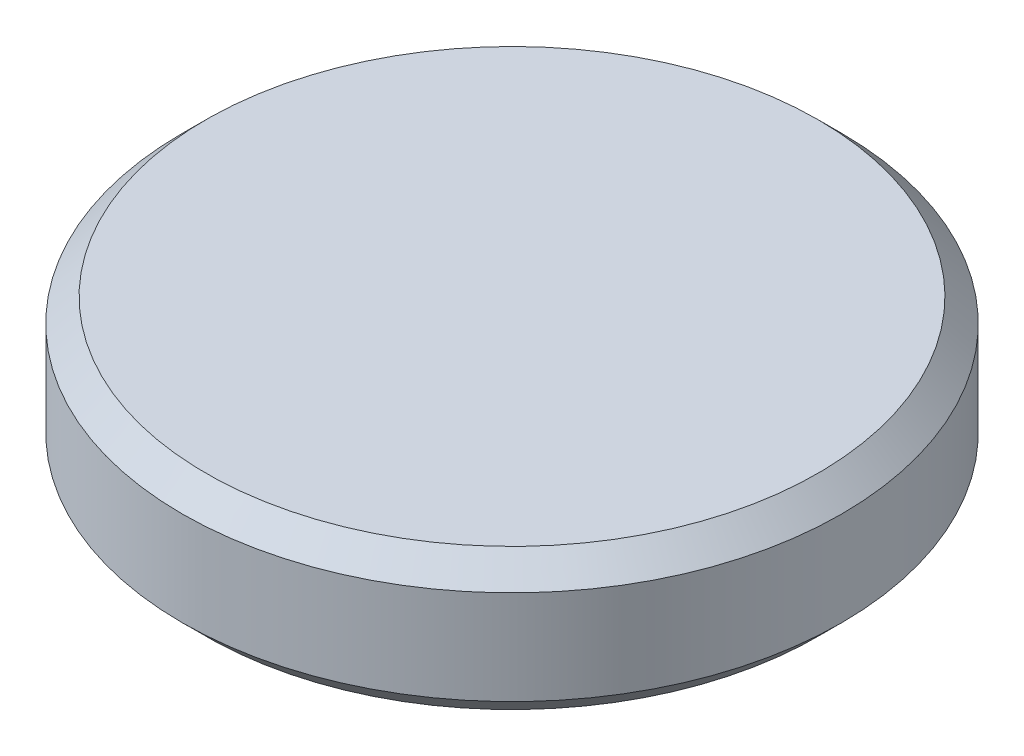
ISO-10303-21;
HEADER;
FILE_DESCRIPTION(('STEP AP214'),'2;1');
FILE_NAME('part.step','',(''),(''),'','','');
FILE_SCHEMA(('AUTOMOTIVE_DESIGN { 1 0 10303 214 1 1 1 1 }'));
ENDSEC;
DATA;
#1=APPLICATION_CONTEXT('core data for automotive mechanical design processes');
#2=APPLICATION_PROTOCOL_DEFINITION('international standard','automotive_design',2000,#1);
#3=PRODUCT_CONTEXT('',#1,'mechanical');
#4=PRODUCT('Part','Part','',(#3));
#5=PRODUCT_RELATED_PRODUCT_CATEGORY('part','',(#4));
#6=PRODUCT_DEFINITION_FORMATION('','',#4);
#7=PRODUCT_DEFINITION_CONTEXT('part definition',#1,'design');
#8=PRODUCT_DEFINITION('design','',#6,#7);
#9=PRODUCT_DEFINITION_SHAPE('','',#8);
#10=(LENGTH_UNIT() NAMED_UNIT(*) SI_UNIT(.MILLI.,.METRE.));
#11=(NAMED_UNIT(*) PLANE_ANGLE_UNIT() SI_UNIT($,.RADIAN.));
#12=(NAMED_UNIT(*) SI_UNIT($,.STERADIAN.) SOLID_ANGLE_UNIT());
#13=UNCERTAINTY_MEASURE_WITH_UNIT(LENGTH_MEASURE(1.E-05),#10,'distance_accuracy_value','');
#14=(GEOMETRIC_REPRESENTATION_CONTEXT(3) GLOBAL_UNCERTAINTY_ASSIGNED_CONTEXT((#13)) GLOBAL_UNIT_ASSIGNED_CONTEXT((#10,
#11,#12)) REPRESENTATION_CONTEXT('',''));
#15=CARTESIAN_POINT('',(0.,0.,0.));
#16=DIRECTION('',(0.,0.,1.));
#17=DIRECTION('',(1.,0.,0.));
#18=AXIS2_PLACEMENT_3D('',#15,#16,#17);
#19=CARTESIAN_POINT('',(0.,0.,0.));
#20=DIRECTION('',(0.,1.,0.));
#21=DIRECTION('',(0.,0.,1.));
#22=AXIS2_PLACEMENT_3D('',#19,#20,#21);
#23=PLANE('',#22);
#24=CARTESIAN_POINT('',(0.,0.,0.));
#25=DIRECTION('',(0.,-1.,0.));
#26=DIRECTION('',(0.,0.,-1.));
#27=AXIS2_PLACEMENT_3D('',#24,#25,#26);
#28=CIRCLE('',#27,6.5);
#29=CARTESIAN_POINT('',(0.,0.,-6.5));
#30=VERTEX_POINT('',#29);
#31=EDGE_CURVE('E10',#30,#30,#28,.T.);
#32=ORIENTED_EDGE('',*,*,#31,.F.);
#33=EDGE_LOOP('',(#32));
#34=FACE_BOUND('',#33,.T.);
#35=ADVANCED_FACE('F35',(#34),#23,.T.);
#36=CARTESIAN_POINT('',(0.,-0.5,0.));
#37=DIRECTION('',(0.,-1.,0.));
#38=DIRECTION('',(0.,0.,-1.));
#39=AXIS2_PLACEMENT_3D('',#36,#37,#38);
#40=CONICAL_SURFACE('',#39,7.,0.785398163397447);
#41=ORIENTED_EDGE('',*,*,#31,.T.);
#42=EDGE_LOOP('',(#41));
#43=FACE_BOUND('',#42,.T.);
#44=CARTESIAN_POINT('',(0.,-0.5,0.));
#45=DIRECTION('',(0.,-1.,0.));
#46=DIRECTION('',(0.,0.,-1.));
#47=AXIS2_PLACEMENT_3D('',#44,#45,#46);
#48=CIRCLE('',#47,7.);
#49=CARTESIAN_POINT('',(0.,-0.5,-7.));
#50=VERTEX_POINT('',#49);
#51=EDGE_CURVE('E41',#50,#50,#48,.T.);
#52=ORIENTED_EDGE('',*,*,#51,.F.);
#53=EDGE_LOOP('',(#52));
#54=FACE_BOUND('',#53,.T.);
#55=ADVANCED_FACE('F77',(#43,#54),#40,.T.);
#56=CARTESIAN_POINT('',(0.,-9.89299525973684,0.));
#57=DIRECTION('',(0.,-1.,0.));
#58=DIRECTION('',(0.,0.,-1.));
#59=AXIS2_PLACEMENT_3D('',#56,#57,#58);
#60=CYLINDRICAL_SURFACE('',#59,7.);
#61=ORIENTED_EDGE('',*,*,#51,.T.);
#62=EDGE_LOOP('',(#61));
#63=FACE_BOUND('',#62,.T.);
#64=CARTESIAN_POINT('',(0.,-2.5,0.));
#65=DIRECTION('',(0.,-1.,0.));
#66=DIRECTION('',(0.,0.,-1.));
#67=AXIS2_PLACEMENT_3D('',#64,#65,#66);
#68=CIRCLE('',#67,7.);
#69=CARTESIAN_POINT('',(0.,-2.5,-7.));
#70=VERTEX_POINT('',#69);
#71=EDGE_CURVE('E45',#70,#70,#68,.T.);
#72=ORIENTED_EDGE('',*,*,#71,.F.);
#73=EDGE_LOOP('',(#72));
#74=FACE_BOUND('',#73,.T.);
#75=ADVANCED_FACE('F82',(#63,#74),#60,.T.);
#76=CARTESIAN_POINT('',(0.,-3.,0.));
#77=DIRECTION('',(0.,1.,0.));
#78=DIRECTION('',(0.,0.,1.));
#79=AXIS2_PLACEMENT_3D('',#76,#77,#78);
#80=CONICAL_SURFACE('',#79,6.5,0.785398163397448);
#81=ORIENTED_EDGE('',*,*,#71,.T.);
#82=EDGE_LOOP('',(#81));
#83=FACE_BOUND('',#82,.T.);
#84=CARTESIAN_POINT('',(0.,-3.,0.));
#85=DIRECTION('',(0.,-1.,0.));
#86=DIRECTION('',(0.,0.,-1.));
#87=AXIS2_PLACEMENT_3D('',#84,#85,#86);
#88=CIRCLE('',#87,6.5);
#89=CARTESIAN_POINT('',(0.,-3.,-6.5));
#90=VERTEX_POINT('',#89);
#91=EDGE_CURVE('E49',#90,#90,#88,.T.);
#92=ORIENTED_EDGE('',*,*,#91,.F.);
#93=EDGE_LOOP('',(#92));
#94=FACE_BOUND('',#93,.T.);
#95=ADVANCED_FACE('F73',(#83,#94),#80,.T.);
#96=CARTESIAN_POINT('',(6.5,-3.,0.));
#97=DIRECTION('',(0.,-1.,0.));
#98=DIRECTION('',(0.,0.,-1.));
#99=AXIS2_PLACEMENT_3D('',#96,#97,#98);
#100=PLANE('',#99);
#101=ORIENTED_EDGE('',*,*,#91,.T.);
#102=EDGE_LOOP('',(#101));
#103=FACE_BOUND('',#102,.T.);
#104=CARTESIAN_POINT('',(0.,-3.,0.));
#105=DIRECTION('',(0.,-1.,0.));
#106=DIRECTION('',(0.,0.,-1.));
#107=AXIS2_PLACEMENT_3D('',#104,#105,#106);
#108=CIRCLE('',#107,1.5);
#109=CARTESIAN_POINT('',(0.,-3.,-1.5));
#110=VERTEX_POINT('',#109);
#111=EDGE_CURVE('E54',#110,#110,#108,.T.);
#112=ORIENTED_EDGE('',*,*,#111,.F.);
#113=EDGE_LOOP('',(#112));
#114=FACE_BOUND('',#113,.T.);
#115=ADVANCED_FACE('F65',(#103,#114),#100,.T.);
#116=CARTESIAN_POINT('',(0.,-9.89299525973684,0.));
#117=DIRECTION('',(0.,-1.,0.));
#118=DIRECTION('',(0.,0.,-1.));
#119=AXIS2_PLACEMENT_3D('',#116,#117,#118);
#120=CYLINDRICAL_SURFACE('',#119,1.5);
#121=ORIENTED_EDGE('',*,*,#111,.T.);
#122=EDGE_LOOP('',(#121));
#123=FACE_BOUND('',#122,.T.);
#124=CARTESIAN_POINT('',(0.,-6.,0.));
#125=DIRECTION('',(0.,-1.,0.));
#126=DIRECTION('',(0.,0.,-1.));
#127=AXIS2_PLACEMENT_3D('',#124,#125,#126);
#128=CIRCLE('',#127,1.5);
#129=CARTESIAN_POINT('',(0.,-6.,-1.5));
#130=VERTEX_POINT('',#129);
#131=EDGE_CURVE('E57',#130,#130,#128,.T.);
#132=ORIENTED_EDGE('',*,*,#131,.F.);
#133=EDGE_LOOP('',(#132));
#134=FACE_BOUND('',#133,.T.);
#135=ADVANCED_FACE('F63',(#123,#134),#120,.T.);
#136=CARTESIAN_POINT('',(1.5,-6.,0.));
#137=DIRECTION('',(0.,-1.,0.));
#138=DIRECTION('',(0.,0.,-1.));
#139=AXIS2_PLACEMENT_3D('',#136,#137,#138);
#140=PLANE('',#139);
#141=ORIENTED_EDGE('',*,*,#131,.T.);
#142=EDGE_LOOP('',(#141));
#143=FACE_BOUND('',#142,.T.);
#144=ADVANCED_FACE('F61',(#143),#140,.T.);
#145=CLOSED_SHELL('',(#35,#55,#75,#95,#115,#135,#144));
#146=MANIFOLD_SOLID_BREP('B2',#145);
#147=ADVANCED_BREP_SHAPE_REPRESENTATION('',(#18,#146),#14);
#148=SHAPE_DEFINITION_REPRESENTATION(#9,#147);
ENDSEC;
END-ISO-10303-21;
